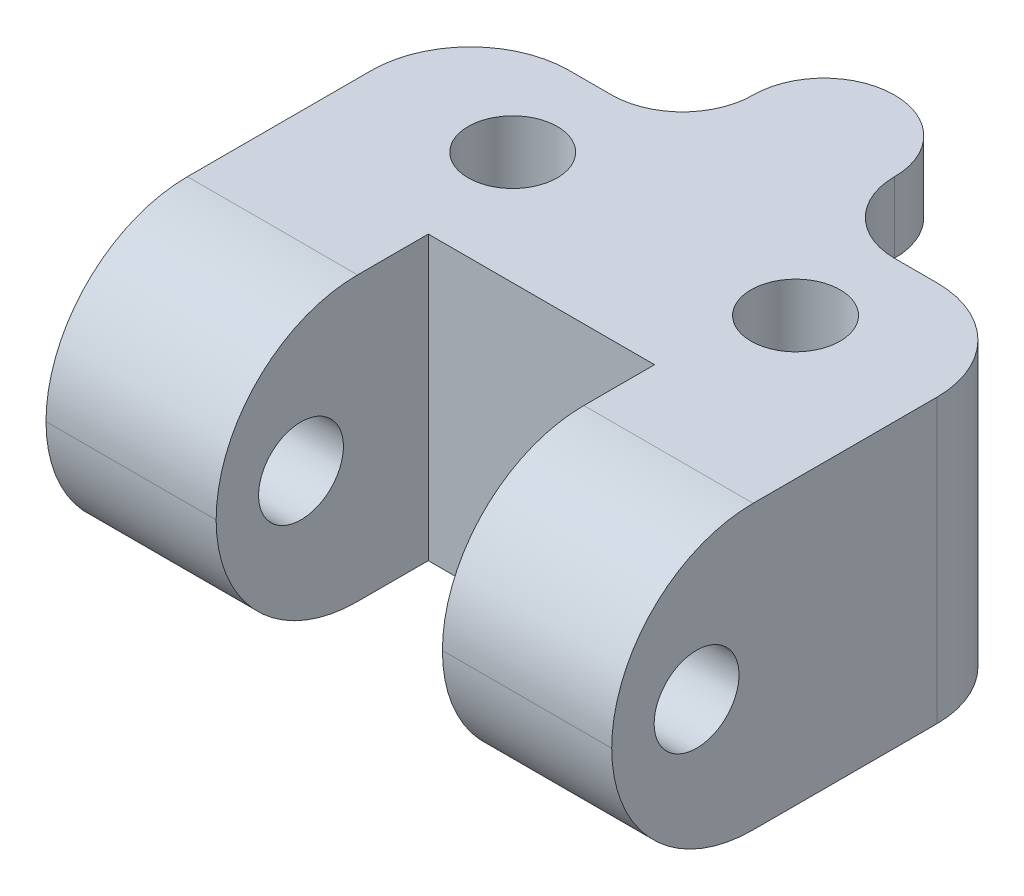
ISO-10303-21;
HEADER;
FILE_DESCRIPTION(('STEP AP214'),'2;1');
FILE_NAME('part.step','',(''),(''),'','','');
FILE_SCHEMA(('AUTOMOTIVE_DESIGN { 1 0 10303 214 1 1 1 1 }'));
ENDSEC;
DATA;
#1=APPLICATION_CONTEXT('core data for automotive mechanical design processes');
#2=APPLICATION_PROTOCOL_DEFINITION('international standard','automotive_design',2000,#1);
#3=PRODUCT_CONTEXT('',#1,'mechanical');
#4=PRODUCT('Part','Part','',(#3));
#5=PRODUCT_RELATED_PRODUCT_CATEGORY('part','',(#4));
#6=PRODUCT_DEFINITION_FORMATION('','',#4);
#7=PRODUCT_DEFINITION_CONTEXT('part definition',#1,'design');
#8=PRODUCT_DEFINITION('design','',#6,#7);
#9=PRODUCT_DEFINITION_SHAPE('','',#8);
#10=(LENGTH_UNIT() NAMED_UNIT(*) SI_UNIT(.MILLI.,.METRE.));
#11=(NAMED_UNIT(*) PLANE_ANGLE_UNIT() SI_UNIT($,.RADIAN.));
#12=(NAMED_UNIT(*) SI_UNIT($,.STERADIAN.) SOLID_ANGLE_UNIT());
#13=UNCERTAINTY_MEASURE_WITH_UNIT(LENGTH_MEASURE(1.E-05),#10,'distance_accuracy_value','');
#14=(GEOMETRIC_REPRESENTATION_CONTEXT(3) GLOBAL_UNCERTAINTY_ASSIGNED_CONTEXT((#13)) GLOBAL_UNIT_ASSIGNED_CONTEXT((#10,
#11,#12)) REPRESENTATION_CONTEXT('',''));
#15=CARTESIAN_POINT('',(0.,0.,0.));
#16=DIRECTION('',(0.,0.,1.));
#17=DIRECTION('',(1.,0.,0.));
#18=AXIS2_PLACEMENT_3D('',#15,#16,#17);
#19=CARTESIAN_POINT('',(0.,20.,-30.));
#20=DIRECTION('',(0.,0.,1.));
#21=DIRECTION('',(1.,0.,0.));
#22=AXIS2_PLACEMENT_3D('',#19,#20,#21);
#23=PLANE('',#22);
#24=DIRECTION('',(-1.,0.,0.));
#25=VECTOR('',#24,1.);
#26=CARTESIAN_POINT('',(0.,20.,-30.));
#27=LINE('',#26,#25);
#28=CARTESIAN_POINT('',(33.,20.,-30.));
#29=VERTEX_POINT('',#28);
#30=CARTESIAN_POINT('',(30.,20.,-30.));
#31=VERTEX_POINT('',#30);
#32=EDGE_CURVE('E210',#29,#31,#27,.T.);
#33=ORIENTED_EDGE('',*,*,#32,.F.);
#34=DIRECTION('',(0.,-1.,0.));
#35=VECTOR('',#34,1.);
#36=CARTESIAN_POINT('',(33.,20.,-30.));
#37=LINE('',#36,#35);
#38=CARTESIAN_POINT('',(33.,0.,-30.));
#39=VERTEX_POINT('',#38);
#40=EDGE_CURVE('E295',#29,#39,#37,.T.);
#41=ORIENTED_EDGE('',*,*,#40,.T.);
#42=DIRECTION('',(-1.,0.,0.));
#43=VECTOR('',#42,1.);
#44=CARTESIAN_POINT('',(0.,0.,-30.));
#45=LINE('',#44,#43);
#46=CARTESIAN_POINT('',(7.,0.,-30.));
#47=VERTEX_POINT('',#46);
#48=EDGE_CURVE('E207',#39,#47,#45,.T.);
#49=ORIENTED_EDGE('',*,*,#48,.T.);
#50=DIRECTION('',(0.,-1.,0.));
#51=VECTOR('',#50,1.);
#52=CARTESIAN_POINT('',(7.,20.,-30.));
#53=LINE('',#52,#51);
#54=CARTESIAN_POINT('',(7.,20.,-30.));
#55=VERTEX_POINT('',#54);
#56=EDGE_CURVE('E291',#47,#55,#53,.F.);
#57=ORIENTED_EDGE('',*,*,#56,.T.);
#58=CARTESIAN_POINT('',(10.,20.,-30.));
#59=VERTEX_POINT('',#58);
#60=EDGE_CURVE('E209',#59,#55,#27,.T.);
#61=ORIENTED_EDGE('',*,*,#60,.F.);
#62=DIRECTION('',(0.,1.,0.));
#63=VECTOR('',#62,1.);
#64=CARTESIAN_POINT('',(10.,15.,-30.));
#65=LINE('',#64,#63);
#66=CARTESIAN_POINT('',(10.,10.,-30.));
#67=VERTEX_POINT('',#66);
#68=EDGE_CURVE('E220',#59,#67,#65,.F.);
#69=ORIENTED_EDGE('',*,*,#68,.T.);
#70=DIRECTION('',(-1.,0.,0.));
#71=VECTOR('',#70,1.);
#72=CARTESIAN_POINT('',(30.,10.,-30.));
#73=LINE('',#72,#71);
#74=CARTESIAN_POINT('',(30.,10.,-30.));
#75=VERTEX_POINT('',#74);
#76=EDGE_CURVE('E236',#67,#75,#73,.F.);
#77=ORIENTED_EDGE('',*,*,#76,.T.);
#78=DIRECTION('',(0.,-1.,0.));
#79=VECTOR('',#78,1.);
#80=CARTESIAN_POINT('',(30.,20.,-30.));
#81=LINE('',#80,#79);
#82=EDGE_CURVE('E222',#75,#31,#81,.F.);
#83=ORIENTED_EDGE('',*,*,#82,.T.);
#84=EDGE_LOOP('',(#33,#41,#49,#57,#61,#69,#77,#83));
#85=FACE_BOUND('',#84,.T.);
#86=ADVANCED_FACE('F39',(#85),#23,.F.);
#87=CARTESIAN_POINT('',(0.,20.,0.));
#88=DIRECTION('',(1.,0.,0.));
#89=DIRECTION('',(0.,0.,-1.));
#90=AXIS2_PLACEMENT_3D('',#87,#88,#89);
#91=PLANE('',#90);
#92=CARTESIAN_POINT('',(0.,10.,-6.));
#93=DIRECTION('',(-1.,0.,0.));
#94=DIRECTION('',(0.,0.,1.));
#95=AXIS2_PLACEMENT_3D('',#92,#93,#94);
#96=CIRCLE('',#95,3.);
#97=CARTESIAN_POINT('',(0.,10.,-3.));
#98=VERTEX_POINT('',#97);
#99=EDGE_CURVE('E249',#98,#98,#96,.T.);
#100=ORIENTED_EDGE('',*,*,#99,.F.);
#101=EDGE_LOOP('',(#100));
#102=FACE_BOUND('',#101,.T.);
#103=DIRECTION('',(0.,0.,1.));
#104=VECTOR('',#103,1.);
#105=CARTESIAN_POINT('',(0.,20.,0.));
#106=LINE('',#105,#104);
#107=CARTESIAN_POINT('',(0.,20.,-23.));
#108=VERTEX_POINT('',#107);
#109=CARTESIAN_POINT('',(0.,20.,-10.));
#110=VERTEX_POINT('',#109);
#111=EDGE_CURVE('E204',#108,#110,#106,.T.);
#112=ORIENTED_EDGE('',*,*,#111,.F.);
#113=DIRECTION('',(0.,-1.,0.));
#114=VECTOR('',#113,1.);
#115=CARTESIAN_POINT('',(0.,20.,-23.));
#116=LINE('',#115,#114);
#117=CARTESIAN_POINT('',(0.,0.,-23.));
#118=VERTEX_POINT('',#117);
#119=EDGE_CURVE('E11',#108,#118,#116,.T.);
#120=ORIENTED_EDGE('',*,*,#119,.T.);
#121=DIRECTION('',(0.,0.,1.));
#122=VECTOR('',#121,1.);
#123=CARTESIAN_POINT('',(0.,0.,0.));
#124=LINE('',#123,#122);
#125=CARTESIAN_POINT('',(0.,0.,-10.));
#126=VERTEX_POINT('',#125);
#127=EDGE_CURVE('E199',#118,#126,#124,.T.);
#128=ORIENTED_EDGE('',*,*,#127,.T.);
#129=CARTESIAN_POINT('',(0.,10.,-10.));
#130=DIRECTION('',(1.,0.,0.));
#131=DIRECTION('',(0.,0.,-1.));
#132=AXIS2_PLACEMENT_3D('',#129,#130,#131);
#133=CIRCLE('',#132,10.);
#134=CARTESIAN_POINT('',(0.,10.,0.));
#135=VERTEX_POINT('',#134);
#136=EDGE_CURVE('E274',#126,#135,#133,.F.);
#137=ORIENTED_EDGE('',*,*,#136,.T.);
#138=CARTESIAN_POINT('',(0.,10.,-10.));
#139=DIRECTION('',(1.,0.,0.));
#140=DIRECTION('',(0.,0.,-1.));
#141=AXIS2_PLACEMENT_3D('',#138,#139,#140);
#142=CIRCLE('',#141,10.);
#143=EDGE_CURVE('E271',#135,#110,#142,.F.);
#144=ORIENTED_EDGE('',*,*,#143,.T.);
#145=EDGE_LOOP('',(#112,#120,#128,#137,#144));
#146=FACE_BOUND('',#145,.T.);
#147=ADVANCED_FACE('F338',(#102,#146),#91,.F.);
#148=CARTESIAN_POINT('',(40.,20.,0.));
#149=DIRECTION('',(-1.,0.,0.));
#150=DIRECTION('',(0.,0.,1.));
#151=AXIS2_PLACEMENT_3D('',#148,#149,#150);
#152=PLANE('',#151);
#153=CARTESIAN_POINT('',(40.,10.,-6.));
#154=DIRECTION('',(-1.,0.,0.));
#155=DIRECTION('',(0.,0.,1.));
#156=AXIS2_PLACEMENT_3D('',#153,#154,#155);
#157=CIRCLE('',#156,3.);
#158=CARTESIAN_POINT('',(40.,10.,-3.));
#159=VERTEX_POINT('',#158);
#160=EDGE_CURVE('E173',#159,#159,#157,.T.);
#161=ORIENTED_EDGE('',*,*,#160,.T.);
#162=EDGE_LOOP('',(#161));
#163=FACE_BOUND('',#162,.T.);
#164=DIRECTION('',(0.,0.,-1.));
#165=VECTOR('',#164,1.);
#166=CARTESIAN_POINT('',(40.,0.,0.));
#167=LINE('',#166,#165);
#168=CARTESIAN_POINT('',(40.,0.,-10.));
#169=VERTEX_POINT('',#168);
#170=CARTESIAN_POINT('',(40.,0.,-23.));
#171=VERTEX_POINT('',#170);
#172=EDGE_CURVE('E214',#169,#171,#167,.T.);
#173=ORIENTED_EDGE('',*,*,#172,.T.);
#174=DIRECTION('',(0.,-1.,0.));
#175=VECTOR('',#174,1.);
#176=CARTESIAN_POINT('',(40.,20.,-23.));
#177=LINE('',#176,#175);
#178=CARTESIAN_POINT('',(40.,20.,-23.));
#179=VERTEX_POINT('',#178);
#180=EDGE_CURVE('E62',#171,#179,#177,.F.);
#181=ORIENTED_EDGE('',*,*,#180,.T.);
#182=DIRECTION('',(0.,0.,-1.));
#183=VECTOR('',#182,1.);
#184=CARTESIAN_POINT('',(40.,20.,0.));
#185=LINE('',#184,#183);
#186=CARTESIAN_POINT('',(40.,20.,-10.));
#187=VERTEX_POINT('',#186);
#188=EDGE_CURVE('E206',#187,#179,#185,.T.);
#189=ORIENTED_EDGE('',*,*,#188,.F.);
#190=CARTESIAN_POINT('',(40.,10.,-10.));
#191=DIRECTION('',(-1.,0.,0.));
#192=DIRECTION('',(0.,0.,1.));
#193=AXIS2_PLACEMENT_3D('',#190,#191,#192);
#194=CIRCLE('',#193,10.);
#195=CARTESIAN_POINT('',(40.,10.,0.));
#196=VERTEX_POINT('',#195);
#197=EDGE_CURVE('E256',#187,#196,#194,.F.);
#198=ORIENTED_EDGE('',*,*,#197,.T.);
#199=CARTESIAN_POINT('',(40.,10.,-10.));
#200=DIRECTION('',(-1.,0.,0.));
#201=DIRECTION('',(0.,0.,1.));
#202=AXIS2_PLACEMENT_3D('',#199,#200,#201);
#203=CIRCLE('',#202,10.);
#204=EDGE_CURVE('E254',#196,#169,#203,.F.);
#205=ORIENTED_EDGE('',*,*,#204,.T.);
#206=EDGE_LOOP('',(#173,#181,#189,#198,#205));
#207=FACE_BOUND('',#206,.T.);
#208=ADVANCED_FACE('F316',(#163,#207),#152,.F.);
#209=CARTESIAN_POINT('',(0.,20.,0.));
#210=DIRECTION('',(0.,-1.,0.));
#211=DIRECTION('',(0.,0.,-1.));
#212=AXIS2_PLACEMENT_3D('',#209,#210,#211);
#213=PLANE('',#212);
#214=CARTESIAN_POINT('',(30.,20.,-23.));
#215=DIRECTION('',(0.,1.,0.));
#216=DIRECTION('',(0.,0.,1.));
#217=AXIS2_PLACEMENT_3D('',#214,#215,#216);
#218=CIRCLE('',#217,3.15);
#219=CARTESIAN_POINT('',(30.,20.,-19.85));
#220=VERTEX_POINT('',#219);
#221=EDGE_CURVE('E203',#220,#220,#218,.T.);
#222=ORIENTED_EDGE('',*,*,#221,.F.);
#223=EDGE_LOOP('',(#222));
#224=FACE_BOUND('',#223,.T.);
#225=CARTESIAN_POINT('',(10.,20.,-23.));
#226=DIRECTION('',(0.,1.,0.));
#227=DIRECTION('',(0.,0.,1.));
#228=AXIS2_PLACEMENT_3D('',#225,#226,#227);
#229=CIRCLE('',#228,3.15);
#230=CARTESIAN_POINT('',(10.,20.,-19.85));
#231=VERTEX_POINT('',#230);
#232=EDGE_CURVE('E200',#231,#231,#229,.T.);
#233=ORIENTED_EDGE('',*,*,#232,.F.);
#234=EDGE_LOOP('',(#233));
#235=FACE_BOUND('',#234,.T.);
#236=ORIENTED_EDGE('',*,*,#188,.T.);
#237=CARTESIAN_POINT('',(33.,20.,-23.));
#238=DIRECTION('',(0.,-1.,0.));
#239=DIRECTION('',(0.,0.,-1.));
#240=AXIS2_PLACEMENT_3D('',#237,#238,#239);
#241=CIRCLE('',#240,7.);
#242=EDGE_CURVE('E47',#179,#29,#241,.F.);
#243=ORIENTED_EDGE('',*,*,#242,.T.);
#244=ORIENTED_EDGE('',*,*,#32,.T.);
#245=CARTESIAN_POINT('',(30.,20.,-35.));
#246=DIRECTION('',(0.,-1.,0.));
#247=DIRECTION('',(0.,0.,-1.));
#248=AXIS2_PLACEMENT_3D('',#245,#246,#247);
#249=CIRCLE('',#248,5.);
#250=CARTESIAN_POINT('',(25.,20.,-35.));
#251=VERTEX_POINT('',#250);
#252=EDGE_CURVE('E228',#31,#251,#249,.T.);
#253=ORIENTED_EDGE('',*,*,#252,.T.);
#254=CARTESIAN_POINT('',(20.,20.,-35.));
#255=DIRECTION('',(0.,-1.,0.));
#256=DIRECTION('',(0.,0.,-1.));
#257=AXIS2_PLACEMENT_3D('',#254,#255,#256);
#258=CIRCLE('',#257,5.);
#259=CARTESIAN_POINT('',(20.,20.,-40.));
#260=VERTEX_POINT('',#259);
#261=EDGE_CURVE('E289',#251,#260,#258,.F.);
#262=ORIENTED_EDGE('',*,*,#261,.T.);
#263=CARTESIAN_POINT('',(20.,20.,-35.));
#264=DIRECTION('',(0.,-1.,0.));
#265=DIRECTION('',(0.,0.,-1.));
#266=AXIS2_PLACEMENT_3D('',#263,#264,#265);
#267=CIRCLE('',#266,5.);
#268=CARTESIAN_POINT('',(15.,20.,-35.));
#269=VERTEX_POINT('',#268);
#270=EDGE_CURVE('E287',#260,#269,#267,.F.);
#271=ORIENTED_EDGE('',*,*,#270,.T.);
#272=CARTESIAN_POINT('',(10.,20.,-35.));
#273=DIRECTION('',(0.,-1.,0.));
#274=DIRECTION('',(0.,0.,-1.));
#275=AXIS2_PLACEMENT_3D('',#272,#273,#274);
#276=CIRCLE('',#275,5.);
#277=EDGE_CURVE('E231',#269,#59,#276,.T.);
#278=ORIENTED_EDGE('',*,*,#277,.T.);
#279=ORIENTED_EDGE('',*,*,#60,.T.);
#280=CARTESIAN_POINT('',(7.,20.,-23.));
#281=DIRECTION('',(0.,-1.,0.));
#282=DIRECTION('',(0.,0.,-1.));
#283=AXIS2_PLACEMENT_3D('',#280,#281,#282);
#284=CIRCLE('',#283,7.);
#285=EDGE_CURVE('E54',#55,#108,#284,.F.);
#286=ORIENTED_EDGE('',*,*,#285,.T.);
#287=ORIENTED_EDGE('',*,*,#111,.T.);
#288=DIRECTION('',(1.,0.,0.));
#289=VECTOR('',#288,1.);
#290=CARTESIAN_POINT('',(0.,20.,-10.));
#291=LINE('',#290,#289);
#292=CARTESIAN_POINT('',(12.0295471871838,20.,-10.));
#293=VERTEX_POINT('',#292);
#294=EDGE_CURVE('E185',#110,#293,#291,.T.);
#295=ORIENTED_EDGE('',*,*,#294,.T.);
#296=DIRECTION('',(0.,0.,1.));
#297=VECTOR('',#296,1.);
#298=CARTESIAN_POINT('',(12.0295471871838,20.,-15.));
#299=LINE('',#298,#297);
#300=CARTESIAN_POINT('',(12.0295471871838,20.,-15.));
#301=VERTEX_POINT('',#300);
#302=EDGE_CURVE('E165',#301,#293,#299,.T.);
#303=ORIENTED_EDGE('',*,*,#302,.F.);
#304=DIRECTION('',(-1.,0.,0.));
#305=VECTOR('',#304,1.);
#306=CARTESIAN_POINT('',(12.0295471871838,20.,-15.));
#307=LINE('',#306,#305);
#308=CARTESIAN_POINT('',(28.0295471871838,20.,-15.));
#309=VERTEX_POINT('',#308);
#310=EDGE_CURVE('E177',#309,#301,#307,.T.);
#311=ORIENTED_EDGE('',*,*,#310,.F.);
#312=DIRECTION('',(0.,0.,-1.));
#313=VECTOR('',#312,1.);
#314=CARTESIAN_POINT('',(28.0295471871838,20.,-15.));
#315=LINE('',#314,#313);
#316=CARTESIAN_POINT('',(28.0295471871838,20.,-10.));
#317=VERTEX_POINT('',#316);
#318=EDGE_CURVE('E181',#317,#309,#315,.T.);
#319=ORIENTED_EDGE('',*,*,#318,.F.);
#320=DIRECTION('',(1.,0.,0.));
#321=VECTOR('',#320,1.);
#322=CARTESIAN_POINT('',(0.,20.,-10.));
#323=LINE('',#322,#321);
#324=EDGE_CURVE('E251',#317,#187,#323,.T.);
#325=ORIENTED_EDGE('',*,*,#324,.T.);
#326=EDGE_LOOP('',(#236,#243,#244,#253,#262,#271,#278,#279,#286,#287,#295,#303,#311,#319,#325));
#327=FACE_BOUND('',#326,.T.);
#328=ADVANCED_FACE('F183',(#224,#235,#327),#213,.F.);
#329=CARTESIAN_POINT('',(0.,0.,0.));
#330=DIRECTION('',(0.,-1.,0.));
#331=DIRECTION('',(0.,0.,-1.));
#332=AXIS2_PLACEMENT_3D('',#329,#330,#331);
#333=PLANE('',#332);
#334=ORIENTED_EDGE('',*,*,#48,.F.);
#335=CARTESIAN_POINT('',(33.,0.,-23.));
#336=DIRECTION('',(0.,-1.,0.));
#337=DIRECTION('',(0.,0.,-1.));
#338=AXIS2_PLACEMENT_3D('',#335,#336,#337);
#339=CIRCLE('',#338,7.);
#340=EDGE_CURVE('E300',#39,#171,#339,.T.);
#341=ORIENTED_EDGE('',*,*,#340,.T.);
#342=ORIENTED_EDGE('',*,*,#172,.F.);
#343=DIRECTION('',(1.,0.,0.));
#344=VECTOR('',#343,1.);
#345=CARTESIAN_POINT('',(28.0295471871838,0.,-10.));
#346=LINE('',#345,#344);
#347=CARTESIAN_POINT('',(28.0295471871838,0.,-10.));
#348=VERTEX_POINT('',#347);
#349=EDGE_CURVE('E265',#169,#348,#346,.F.);
#350=ORIENTED_EDGE('',*,*,#349,.T.);
#351=DIRECTION('',(0.,0.,-1.));
#352=VECTOR('',#351,1.);
#353=CARTESIAN_POINT('',(28.0295471871838,0.,-15.));
#354=LINE('',#353,#352);
#355=CARTESIAN_POINT('',(28.0295471871838,0.,-15.));
#356=VERTEX_POINT('',#355);
#357=EDGE_CURVE('E186',#348,#356,#354,.T.);
#358=ORIENTED_EDGE('',*,*,#357,.T.);
#359=DIRECTION('',(-1.,0.,0.));
#360=VECTOR('',#359,1.);
#361=CARTESIAN_POINT('',(12.0295471871838,0.,-15.));
#362=LINE('',#361,#360);
#363=CARTESIAN_POINT('',(12.0295471871838,0.,-15.));
#364=VERTEX_POINT('',#363);
#365=EDGE_CURVE('E188',#356,#364,#362,.T.);
#366=ORIENTED_EDGE('',*,*,#365,.T.);
#367=DIRECTION('',(0.,0.,1.));
#368=VECTOR('',#367,1.);
#369=CARTESIAN_POINT('',(12.0295471871838,0.,-15.));
#370=LINE('',#369,#368);
#371=CARTESIAN_POINT('',(12.0295471871838,0.,-10.));
#372=VERTEX_POINT('',#371);
#373=EDGE_CURVE('E168',#364,#372,#370,.T.);
#374=ORIENTED_EDGE('',*,*,#373,.T.);
#375=DIRECTION('',(1.,0.,0.));
#376=VECTOR('',#375,1.);
#377=CARTESIAN_POINT('',(0.,0.,-10.));
#378=LINE('',#377,#376);
#379=EDGE_CURVE('E262',#372,#126,#378,.F.);
#380=ORIENTED_EDGE('',*,*,#379,.T.);
#381=ORIENTED_EDGE('',*,*,#127,.F.);
#382=CARTESIAN_POINT('',(7.,0.,-23.));
#383=DIRECTION('',(0.,-1.,0.));
#384=DIRECTION('',(0.,0.,-1.));
#385=AXIS2_PLACEMENT_3D('',#382,#383,#384);
#386=CIRCLE('',#385,7.);
#387=EDGE_CURVE('E298',#118,#47,#386,.T.);
#388=ORIENTED_EDGE('',*,*,#387,.T.);
#389=EDGE_LOOP('',(#334,#341,#342,#350,#358,#366,#374,#380,#381,#388));
#390=FACE_BOUND('',#389,.T.);
#391=CARTESIAN_POINT('',(30.,0.,-23.));
#392=DIRECTION('',(0.,1.,0.));
#393=DIRECTION('',(0.,0.,1.));
#394=AXIS2_PLACEMENT_3D('',#391,#392,#393);
#395=CIRCLE('',#394,3.15);
#396=CARTESIAN_POINT('',(30.,0.,-19.85));
#397=VERTEX_POINT('',#396);
#398=EDGE_CURVE('E193',#397,#397,#395,.T.);
#399=ORIENTED_EDGE('',*,*,#398,.T.);
#400=EDGE_LOOP('',(#399));
#401=FACE_BOUND('',#400,.T.);
#402=CARTESIAN_POINT('',(10.,0.,-23.));
#403=DIRECTION('',(0.,1.,0.));
#404=DIRECTION('',(0.,0.,1.));
#405=AXIS2_PLACEMENT_3D('',#402,#403,#404);
#406=CIRCLE('',#405,3.15);
#407=CARTESIAN_POINT('',(10.,0.,-19.85));
#408=VERTEX_POINT('',#407);
#409=EDGE_CURVE('E196',#408,#408,#406,.T.);
#410=ORIENTED_EDGE('',*,*,#409,.T.);
#411=EDGE_LOOP('',(#410));
#412=FACE_BOUND('',#411,.T.);
#413=ADVANCED_FACE('F313',(#390,#401,#412),#333,.T.);
#414=CARTESIAN_POINT('',(10.,0.,-23.));
#415=DIRECTION('',(0.,1.,0.));
#416=DIRECTION('',(0.,0.,1.));
#417=AXIS2_PLACEMENT_3D('',#414,#415,#416);
#418=CYLINDRICAL_SURFACE('',#417,3.15);
#419=ORIENTED_EDGE('',*,*,#409,.F.);
#420=EDGE_LOOP('',(#419));
#421=FACE_BOUND('',#420,.T.);
#422=ORIENTED_EDGE('',*,*,#232,.T.);
#423=EDGE_LOOP('',(#422));
#424=FACE_BOUND('',#423,.T.);
#425=ADVANCED_FACE('F401',(#421,#424),#418,.F.);
#426=CARTESIAN_POINT('',(30.,0.,-23.));
#427=DIRECTION('',(0.,1.,0.));
#428=DIRECTION('',(0.,0.,1.));
#429=AXIS2_PLACEMENT_3D('',#426,#427,#428);
#430=CYLINDRICAL_SURFACE('',#429,3.15);
#431=ORIENTED_EDGE('',*,*,#398,.F.);
#432=EDGE_LOOP('',(#431));
#433=FACE_BOUND('',#432,.T.);
#434=ORIENTED_EDGE('',*,*,#221,.T.);
#435=EDGE_LOOP('',(#434));
#436=FACE_BOUND('',#435,.T.);
#437=ADVANCED_FACE('F398',(#433,#436),#430,.F.);
#438=CARTESIAN_POINT('',(12.0295471871838,0.,-15.));
#439=DIRECTION('',(-1.,0.,0.));
#440=DIRECTION('',(0.,0.,1.));
#441=AXIS2_PLACEMENT_3D('',#438,#439,#440);
#442=PLANE('',#441);
#443=CARTESIAN_POINT('',(12.0295471871838,10.,-6.));
#444=DIRECTION('',(-1.,0.,0.));
#445=DIRECTION('',(0.,0.,1.));
#446=AXIS2_PLACEMENT_3D('',#443,#444,#445);
#447=CIRCLE('',#446,3.);
#448=CARTESIAN_POINT('',(12.0295471871838,10.,-3.));
#449=VERTEX_POINT('',#448);
#450=EDGE_CURVE('E248',#449,#449,#447,.T.);
#451=ORIENTED_EDGE('',*,*,#450,.T.);
#452=EDGE_LOOP('',(#451));
#453=FACE_BOUND('',#452,.T.);
#454=CARTESIAN_POINT('',(12.0295471871838,10.,-10.));
#455=DIRECTION('',(-1.,0.,0.));
#456=DIRECTION('',(0.,0.,1.));
#457=AXIS2_PLACEMENT_3D('',#454,#455,#456);
#458=CIRCLE('',#457,10.);
#459=CARTESIAN_POINT('',(12.0295471871838,10.,0.));
#460=VERTEX_POINT('',#459);
#461=EDGE_CURVE('E267',#293,#460,#458,.F.);
#462=ORIENTED_EDGE('',*,*,#461,.T.);
#463=CARTESIAN_POINT('',(12.0295471871838,10.,-10.));
#464=DIRECTION('',(-1.,0.,0.));
#465=DIRECTION('',(0.,0.,1.));
#466=AXIS2_PLACEMENT_3D('',#463,#464,#465);
#467=CIRCLE('',#466,10.);
#468=EDGE_CURVE('E269',#460,#372,#467,.F.);
#469=ORIENTED_EDGE('',*,*,#468,.T.);
#470=ORIENTED_EDGE('',*,*,#373,.F.);
#471=DIRECTION('',(0.,1.,0.));
#472=VECTOR('',#471,1.);
#473=CARTESIAN_POINT('',(12.0295471871838,0.,-15.));
#474=LINE('',#473,#472);
#475=EDGE_CURVE('E161',#364,#301,#474,.T.);
#476=ORIENTED_EDGE('',*,*,#475,.T.);
#477=ORIENTED_EDGE('',*,*,#302,.T.);
#478=EDGE_LOOP('',(#462,#469,#470,#476,#477));
#479=FACE_BOUND('',#478,.T.);
#480=ADVANCED_FACE('F163',(#453,#479),#442,.F.);
#481=CARTESIAN_POINT('',(12.0295471871838,0.,-15.));
#482=DIRECTION('',(0.,0.,-1.));
#483=DIRECTION('',(-1.,0.,0.));
#484=AXIS2_PLACEMENT_3D('',#481,#482,#483);
#485=PLANE('',#484);
#486=ORIENTED_EDGE('',*,*,#310,.T.);
#487=ORIENTED_EDGE('',*,*,#475,.F.);
#488=ORIENTED_EDGE('',*,*,#365,.F.);
#489=DIRECTION('',(0.,1.,0.));
#490=VECTOR('',#489,1.);
#491=CARTESIAN_POINT('',(28.0295471871838,0.,-15.));
#492=LINE('',#491,#490);
#493=EDGE_CURVE('E172',#356,#309,#492,.T.);
#494=ORIENTED_EDGE('',*,*,#493,.T.);
#495=EDGE_LOOP('',(#486,#487,#488,#494));
#496=FACE_BOUND('',#495,.T.);
#497=ADVANCED_FACE('F178',(#496),#485,.F.);
#498=CARTESIAN_POINT('',(28.0295471871838,0.,-15.));
#499=DIRECTION('',(1.,0.,0.));
#500=DIRECTION('',(0.,0.,-1.));
#501=AXIS2_PLACEMENT_3D('',#498,#499,#500);
#502=PLANE('',#501);
#503=CARTESIAN_POINT('',(28.0295471871838,10.,-6.));
#504=DIRECTION('',(1.,0.,0.));
#505=DIRECTION('',(0.,0.,-1.));
#506=AXIS2_PLACEMENT_3D('',#503,#504,#505);
#507=CIRCLE('',#506,3.);
#508=CARTESIAN_POINT('',(28.0295471871838,10.,-9.));
#509=VERTEX_POINT('',#508);
#510=EDGE_CURVE('E245',#509,#509,#507,.T.);
#511=ORIENTED_EDGE('',*,*,#510,.T.);
#512=EDGE_LOOP('',(#511));
#513=FACE_BOUND('',#512,.T.);
#514=CARTESIAN_POINT('',(28.0295471871838,10.,-10.));
#515=DIRECTION('',(1.,0.,0.));
#516=DIRECTION('',(0.,0.,-1.));
#517=AXIS2_PLACEMENT_3D('',#514,#515,#516);
#518=CIRCLE('',#517,10.);
#519=CARTESIAN_POINT('',(28.0295471871838,10.,0.));
#520=VERTEX_POINT('',#519);
#521=EDGE_CURVE('E258',#348,#520,#518,.F.);
#522=ORIENTED_EDGE('',*,*,#521,.T.);
#523=CARTESIAN_POINT('',(28.0295471871838,10.,-10.));
#524=DIRECTION('',(1.,0.,0.));
#525=DIRECTION('',(0.,0.,-1.));
#526=AXIS2_PLACEMENT_3D('',#523,#524,#525);
#527=CIRCLE('',#526,10.);
#528=EDGE_CURVE('E260',#520,#317,#527,.F.);
#529=ORIENTED_EDGE('',*,*,#528,.T.);
#530=ORIENTED_EDGE('',*,*,#318,.T.);
#531=ORIENTED_EDGE('',*,*,#493,.F.);
#532=ORIENTED_EDGE('',*,*,#357,.F.);
#533=EDGE_LOOP('',(#522,#529,#530,#531,#532));
#534=FACE_BOUND('',#533,.T.);
#535=ADVANCED_FACE('F327',(#513,#534),#502,.F.);
#536=CARTESIAN_POINT('',(25.,15.,-40.));
#537=DIRECTION('',(0.,1.,0.));
#538=DIRECTION('',(0.,0.,1.));
#539=AXIS2_PLACEMENT_3D('',#536,#537,#538);
#540=PLANE('',#539);
#541=CARTESIAN_POINT('',(20.,15.,-35.));
#542=DIRECTION('',(0.,1.,0.));
#543=DIRECTION('',(0.,0.,1.));
#544=AXIS2_PLACEMENT_3D('',#541,#542,#543);
#545=CIRCLE('',#544,5.);
#546=CARTESIAN_POINT('',(15.,15.,-35.));
#547=VERTEX_POINT('',#546);
#548=CARTESIAN_POINT('',(20.,15.,-40.));
#549=VERTEX_POINT('',#548);
#550=EDGE_CURVE('E276',#547,#549,#545,.F.);
#551=ORIENTED_EDGE('',*,*,#550,.T.);
#552=CARTESIAN_POINT('',(20.,15.,-35.));
#553=DIRECTION('',(0.,1.,0.));
#554=DIRECTION('',(0.,0.,1.));
#555=AXIS2_PLACEMENT_3D('',#552,#553,#554);
#556=CIRCLE('',#555,5.);
#557=CARTESIAN_POINT('',(25.,15.,-35.));
#558=VERTEX_POINT('',#557);
#559=EDGE_CURVE('E285',#549,#558,#556,.F.);
#560=ORIENTED_EDGE('',*,*,#559,.T.);
#561=DIRECTION('',(-1.,0.,0.));
#562=VECTOR('',#561,1.);
#563=CARTESIAN_POINT('',(10.,15.,-35.));
#564=LINE('',#563,#562);
#565=EDGE_CURVE('E233',#558,#547,#564,.T.);
#566=ORIENTED_EDGE('',*,*,#565,.T.);
#567=EDGE_LOOP('',(#551,#560,#566));
#568=FACE_BOUND('',#567,.T.);
#569=ADVANCED_FACE('F369',(#568),#540,.F.);
#570=CARTESIAN_POINT('',(30.,20.,-35.));
#571=DIRECTION('',(0.,1.,0.));
#572=DIRECTION('',(0.,0.,1.));
#573=AXIS2_PLACEMENT_3D('',#570,#571,#572);
#574=CYLINDRICAL_SURFACE('',#573,5.);
#575=ORIENTED_EDGE('',*,*,#252,.F.);
#576=ORIENTED_EDGE('',*,*,#82,.F.);
#577=CARTESIAN_POINT('',(30.,10.,-35.));
#578=DIRECTION('',(0.707106781186547,0.707106781186547,0.));
#579=DIRECTION('',(-0.707106781186547,0.707106781186547,0.));
#580=AXIS2_PLACEMENT_3D('',#577,#578,#579);
#581=ELLIPSE('',#580,7.07106781186547,5.);
#582=EDGE_CURVE('E242',#75,#558,#581,.F.);
#583=ORIENTED_EDGE('',*,*,#582,.T.);
#584=DIRECTION('',(0.,-1.,0.));
#585=VECTOR('',#584,1.);
#586=CARTESIAN_POINT('',(25.,15.,-35.));
#587=LINE('',#586,#585);
#588=EDGE_CURVE('E212',#251,#558,#587,.T.);
#589=ORIENTED_EDGE('',*,*,#588,.F.);
#590=EDGE_LOOP('',(#575,#576,#583,#589));
#591=FACE_BOUND('',#590,.T.);
#592=ADVANCED_FACE('F365',(#591),#574,.F.);
#593=CARTESIAN_POINT('',(10.,20.,-35.));
#594=DIRECTION('',(0.,-1.,0.));
#595=DIRECTION('',(1.,0.,0.));
#596=AXIS2_PLACEMENT_3D('',#593,#594,#595);
#597=CYLINDRICAL_SURFACE('',#596,5.);
#598=DIRECTION('',(0.,1.,0.));
#599=VECTOR('',#598,1.);
#600=CARTESIAN_POINT('',(15.,20.,-35.));
#601=LINE('',#600,#599);
#602=EDGE_CURVE('E225',#547,#269,#601,.T.);
#603=ORIENTED_EDGE('',*,*,#602,.F.);
#604=CARTESIAN_POINT('',(10.,10.,-35.));
#605=DIRECTION('',(0.707106781186547,-0.707106781186548,0.));
#606=DIRECTION('',(-0.707106781186548,-0.707106781186547,0.));
#607=AXIS2_PLACEMENT_3D('',#604,#605,#606);
#608=ELLIPSE('',#607,7.07106781186548,5.);
#609=EDGE_CURVE('E239',#547,#67,#608,.T.);
#610=ORIENTED_EDGE('',*,*,#609,.T.);
#611=ORIENTED_EDGE('',*,*,#68,.F.);
#612=ORIENTED_EDGE('',*,*,#277,.F.);
#613=EDGE_LOOP('',(#603,#610,#611,#612));
#614=FACE_BOUND('',#613,.T.);
#615=ADVANCED_FACE('F368',(#614),#597,.F.);
#616=CARTESIAN_POINT('',(25.,10.,-35.));
#617=DIRECTION('',(1.,0.,0.));
#618=DIRECTION('',(0.,0.,-1.));
#619=AXIS2_PLACEMENT_3D('',#616,#617,#618);
#620=CYLINDRICAL_SURFACE('',#619,5.);
#621=ORIENTED_EDGE('',*,*,#582,.F.);
#622=ORIENTED_EDGE('',*,*,#76,.F.);
#623=ORIENTED_EDGE('',*,*,#609,.F.);
#624=ORIENTED_EDGE('',*,*,#565,.F.);
#625=EDGE_LOOP('',(#621,#622,#623,#624));
#626=FACE_BOUND('',#625,.T.);
#627=ADVANCED_FACE('F373',(#626),#620,.F.);
#628=CARTESIAN_POINT('',(140.,10.,-6.));
#629=DIRECTION('',(-1.,0.,0.));
#630=DIRECTION('',(0.,0.,1.));
#631=AXIS2_PLACEMENT_3D('',#628,#629,#630);
#632=CYLINDRICAL_SURFACE('',#631,3.);
#633=ORIENTED_EDGE('',*,*,#510,.F.);
#634=EDGE_LOOP('',(#633));
#635=FACE_BOUND('',#634,.T.);
#636=ORIENTED_EDGE('',*,*,#160,.F.);
#637=EDGE_LOOP('',(#636));
#638=FACE_BOUND('',#637,.T.);
#639=ADVANCED_FACE('F376',(#635,#638),#632,.F.);
#640=ORIENTED_EDGE('',*,*,#99,.T.);
#641=EDGE_LOOP('',(#640));
#642=FACE_BOUND('',#641,.T.);
#643=ORIENTED_EDGE('',*,*,#450,.F.);
#644=EDGE_LOOP('',(#643));
#645=FACE_BOUND('',#644,.T.);
#646=ADVANCED_FACE('F380',(#642,#645),#632,.F.);
#647=CARTESIAN_POINT('',(0.,10.,-10.));
#648=DIRECTION('',(-1.,0.,0.));
#649=DIRECTION('',(0.,0.,1.));
#650=AXIS2_PLACEMENT_3D('',#647,#648,#649);
#651=CYLINDRICAL_SURFACE('',#650,10.);
#652=DIRECTION('',(1.,0.,0.));
#653=VECTOR('',#652,1.);
#654=CARTESIAN_POINT('',(40.,10.,0.));
#655=LINE('',#654,#653);
#656=EDGE_CURVE('E277',#520,#196,#655,.T.);
#657=ORIENTED_EDGE('',*,*,#656,.F.);
#658=ORIENTED_EDGE('',*,*,#521,.F.);
#659=ORIENTED_EDGE('',*,*,#349,.F.);
#660=ORIENTED_EDGE('',*,*,#204,.F.);
#661=EDGE_LOOP('',(#657,#658,#659,#660));
#662=FACE_BOUND('',#661,.T.);
#663=ADVANCED_FACE('F320',(#662),#651,.T.);
#664=CARTESIAN_POINT('',(0.,10.,-10.));
#665=DIRECTION('',(1.,0.,0.));
#666=DIRECTION('',(0.,0.,-1.));
#667=AXIS2_PLACEMENT_3D('',#664,#665,#666);
#668=CYLINDRICAL_SURFACE('',#667,10.);
#669=ORIENTED_EDGE('',*,*,#528,.F.);
#670=ORIENTED_EDGE('',*,*,#656,.T.);
#671=ORIENTED_EDGE('',*,*,#197,.F.);
#672=ORIENTED_EDGE('',*,*,#324,.F.);
#673=EDGE_LOOP('',(#669,#670,#671,#672));
#674=FACE_BOUND('',#673,.T.);
#675=ADVANCED_FACE('F324',(#674),#668,.T.);
#676=CARTESIAN_POINT('',(0.,10.,-10.));
#677=DIRECTION('',(1.,0.,0.));
#678=DIRECTION('',(0.,0.,-1.));
#679=AXIS2_PLACEMENT_3D('',#676,#677,#678);
#680=CYLINDRICAL_SURFACE('',#679,10.);
#681=ORIENTED_EDGE('',*,*,#294,.F.);
#682=ORIENTED_EDGE('',*,*,#143,.F.);
#683=DIRECTION('',(1.,0.,0.));
#684=VECTOR('',#683,1.);
#685=CARTESIAN_POINT('',(0.,10.,0.));
#686=LINE('',#685,#684);
#687=EDGE_CURVE('E280',#460,#135,#686,.F.);
#688=ORIENTED_EDGE('',*,*,#687,.F.);
#689=ORIENTED_EDGE('',*,*,#461,.F.);
#690=EDGE_LOOP('',(#681,#682,#688,#689));
#691=FACE_BOUND('',#690,.T.);
#692=ADVANCED_FACE('F340',(#691),#680,.T.);
#693=CARTESIAN_POINT('',(0.,10.,-10.));
#694=DIRECTION('',(-1.,0.,0.));
#695=DIRECTION('',(0.,0.,1.));
#696=AXIS2_PLACEMENT_3D('',#693,#694,#695);
#697=CYLINDRICAL_SURFACE('',#696,10.);
#698=ORIENTED_EDGE('',*,*,#136,.F.);
#699=ORIENTED_EDGE('',*,*,#379,.F.);
#700=ORIENTED_EDGE('',*,*,#468,.F.);
#701=ORIENTED_EDGE('',*,*,#687,.T.);
#702=EDGE_LOOP('',(#698,#699,#700,#701));
#703=FACE_BOUND('',#702,.T.);
#704=ADVANCED_FACE('F334',(#703),#697,.T.);
#705=CARTESIAN_POINT('',(20.,0.,-35.));
#706=DIRECTION('',(0.,-1.,0.));
#707=DIRECTION('',(1.,0.,0.));
#708=AXIS2_PLACEMENT_3D('',#705,#706,#707);
#709=CYLINDRICAL_SURFACE('',#708,5.);
#710=ORIENTED_EDGE('',*,*,#602,.T.);
#711=ORIENTED_EDGE('',*,*,#270,.F.);
#712=DIRECTION('',(0.,1.,0.));
#713=VECTOR('',#712,1.);
#714=CARTESIAN_POINT('',(20.,20.,-40.));
#715=LINE('',#714,#713);
#716=EDGE_CURVE('E283',#549,#260,#715,.T.);
#717=ORIENTED_EDGE('',*,*,#716,.F.);
#718=ORIENTED_EDGE('',*,*,#550,.F.);
#719=EDGE_LOOP('',(#710,#711,#717,#718));
#720=FACE_BOUND('',#719,.T.);
#721=ADVANCED_FACE('F347',(#720),#709,.T.);
#722=CARTESIAN_POINT('',(20.,0.,-35.));
#723=DIRECTION('',(0.,1.,0.));
#724=DIRECTION('',(0.,0.,1.));
#725=AXIS2_PLACEMENT_3D('',#722,#723,#724);
#726=CYLINDRICAL_SURFACE('',#725,5.);
#727=ORIENTED_EDGE('',*,*,#261,.F.);
#728=ORIENTED_EDGE('',*,*,#588,.T.);
#729=ORIENTED_EDGE('',*,*,#559,.F.);
#730=ORIENTED_EDGE('',*,*,#716,.T.);
#731=EDGE_LOOP('',(#727,#728,#729,#730));
#732=FACE_BOUND('',#731,.T.);
#733=ADVANCED_FACE('F448',(#732),#726,.T.);
#734=CARTESIAN_POINT('',(33.,20.,-23.));
#735=DIRECTION('',(0.,-1.,0.));
#736=DIRECTION('',(0.,0.,-1.));
#737=AXIS2_PLACEMENT_3D('',#734,#735,#736);
#738=CYLINDRICAL_SURFACE('',#737,7.);
#739=ORIENTED_EDGE('',*,*,#242,.F.);
#740=ORIENTED_EDGE('',*,*,#180,.F.);
#741=ORIENTED_EDGE('',*,*,#340,.F.);
#742=ORIENTED_EDGE('',*,*,#40,.F.);
#743=EDGE_LOOP('',(#739,#740,#741,#742));
#744=FACE_BOUND('',#743,.T.);
#745=ADVANCED_FACE('F310',(#744),#738,.T.);
#746=CARTESIAN_POINT('',(7.,20.,-23.));
#747=DIRECTION('',(0.,-1.,0.));
#748=DIRECTION('',(0.,0.,-1.));
#749=AXIS2_PLACEMENT_3D('',#746,#747,#748);
#750=CYLINDRICAL_SURFACE('',#749,7.);
#751=ORIENTED_EDGE('',*,*,#285,.F.);
#752=ORIENTED_EDGE('',*,*,#56,.F.);
#753=ORIENTED_EDGE('',*,*,#387,.F.);
#754=ORIENTED_EDGE('',*,*,#119,.F.);
#755=EDGE_LOOP('',(#751,#752,#753,#754));
#756=FACE_BOUND('',#755,.T.);
#757=ADVANCED_FACE('F41',(#756),#750,.T.);
#758=CLOSED_SHELL('',(#86,#147,#208,#328,#413,#425,#437,#480,#497,#535,#569,#592,#615,#627,#639,
#646,#663,#675,#692,#704,#721,#733,#745,#757));
#759=MANIFOLD_SOLID_BREP('B2',#758);
#760=ADVANCED_BREP_SHAPE_REPRESENTATION('',(#18,#759),#14);
#761=SHAPE_DEFINITION_REPRESENTATION(#9,#760);
ENDSEC;
END-ISO-10303-21;
